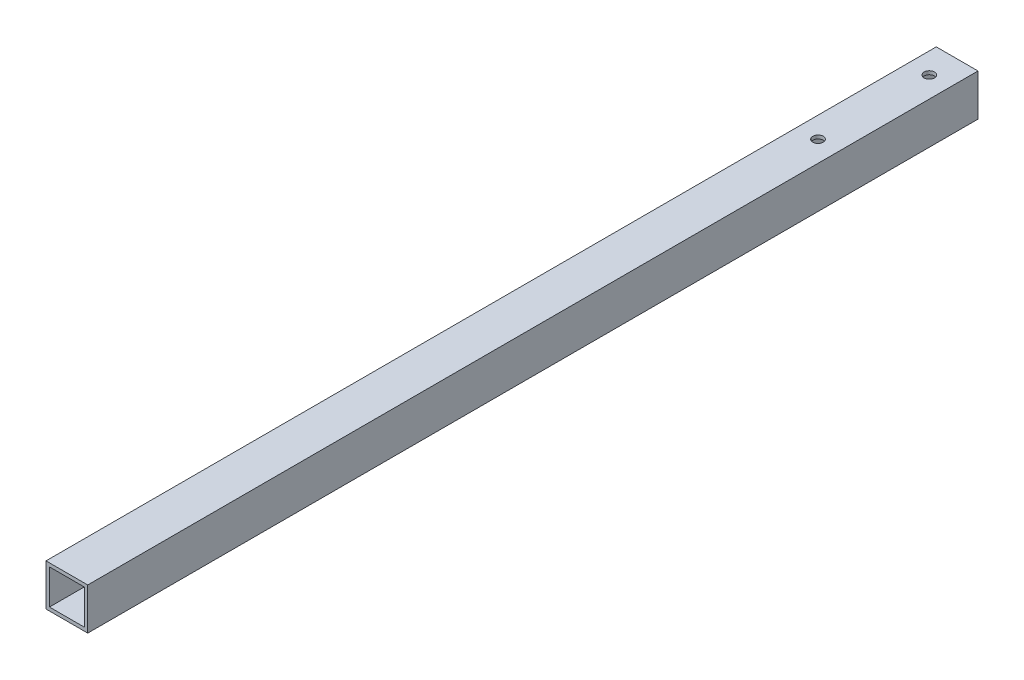
ISO-10303-21;
HEADER;
FILE_DESCRIPTION(('STEP AP214'),'2;1');
FILE_NAME('part.step','',(''),(''),'','','');
FILE_SCHEMA(('AUTOMOTIVE_DESIGN { 1 0 10303 214 1 1 1 1 }'));
ENDSEC;
DATA;
#1=APPLICATION_CONTEXT('core data for automotive mechanical design processes');
#2=APPLICATION_PROTOCOL_DEFINITION('international standard','automotive_design',2000,#1);
#3=PRODUCT_CONTEXT('',#1,'mechanical');
#4=PRODUCT('Part','Part','',(#3));
#5=PRODUCT_RELATED_PRODUCT_CATEGORY('part','',(#4));
#6=PRODUCT_DEFINITION_FORMATION('','',#4);
#7=PRODUCT_DEFINITION_CONTEXT('part definition',#1,'design');
#8=PRODUCT_DEFINITION('design','',#6,#7);
#9=PRODUCT_DEFINITION_SHAPE('','',#8);
#10=(LENGTH_UNIT() NAMED_UNIT(*) SI_UNIT(.MILLI.,.METRE.));
#11=(NAMED_UNIT(*) PLANE_ANGLE_UNIT() SI_UNIT($,.RADIAN.));
#12=(NAMED_UNIT(*) SI_UNIT($,.STERADIAN.) SOLID_ANGLE_UNIT());
#13=UNCERTAINTY_MEASURE_WITH_UNIT(LENGTH_MEASURE(1.E-05),#10,'distance_accuracy_value','');
#14=(GEOMETRIC_REPRESENTATION_CONTEXT(3) GLOBAL_UNCERTAINTY_ASSIGNED_CONTEXT((#13)) GLOBAL_UNIT_ASSIGNED_CONTEXT((#10,
#11,#12)) REPRESENTATION_CONTEXT('',''));
#15=CARTESIAN_POINT('',(0.,0.,0.));
#16=DIRECTION('',(0.,0.,1.));
#17=DIRECTION('',(1.,0.,0.));
#18=AXIS2_PLACEMENT_3D('',#15,#16,#17);
#19=CARTESIAN_POINT('',(0.,0.,406.4));
#20=DIRECTION('',(0.,0.,-1.));
#21=DIRECTION('',(-1.,0.,0.));
#22=AXIS2_PLACEMENT_3D('',#19,#20,#21);
#23=PLANE('',#22);
#24=DIRECTION('',(0.,1.,0.));
#25=VECTOR('',#24,1.);
#26=CARTESIAN_POINT('',(9.525,-9.525,406.4));
#27=LINE('',#26,#25);
#28=CARTESIAN_POINT('',(9.525,-9.525,406.4));
#29=VERTEX_POINT('',#28);
#30=CARTESIAN_POINT('',(9.525,9.525,406.4));
#31=VERTEX_POINT('',#30);
#32=EDGE_CURVE('E138',#29,#31,#27,.T.);
#33=ORIENTED_EDGE('',*,*,#32,.T.);
#34=DIRECTION('',(-1.,0.,0.));
#35=VECTOR('',#34,1.);
#36=CARTESIAN_POINT('',(-9.525,9.525,406.4));
#37=LINE('',#36,#35);
#38=CARTESIAN_POINT('',(-9.525,9.525,406.4));
#39=VERTEX_POINT('',#38);
#40=EDGE_CURVE('E141',#31,#39,#37,.T.);
#41=ORIENTED_EDGE('',*,*,#40,.T.);
#42=DIRECTION('',(0.,-1.,0.));
#43=VECTOR('',#42,1.);
#44=CARTESIAN_POINT('',(-9.525,-9.525,406.4));
#45=LINE('',#44,#43);
#46=CARTESIAN_POINT('',(-9.525,-9.525,406.4));
#47=VERTEX_POINT('',#46);
#48=EDGE_CURVE('E144',#39,#47,#45,.T.);
#49=ORIENTED_EDGE('',*,*,#48,.T.);
#50=DIRECTION('',(1.,0.,0.));
#51=VECTOR('',#50,1.);
#52=CARTESIAN_POINT('',(-9.525,-9.525,406.4));
#53=LINE('',#52,#51);
#54=EDGE_CURVE('E146',#47,#29,#53,.T.);
#55=ORIENTED_EDGE('',*,*,#54,.T.);
#56=EDGE_LOOP('',(#33,#41,#49,#55));
#57=FACE_BOUND('',#56,.T.);
#58=DIRECTION('',(0.,1.,0.));
#59=VECTOR('',#58,1.);
#60=CARTESIAN_POINT('',(7.9375,-7.9375,406.4));
#61=LINE('',#60,#59);
#62=CARTESIAN_POINT('',(7.9375,-7.9375,406.4));
#63=VERTEX_POINT('',#62);
#64=CARTESIAN_POINT('',(7.9375,7.9375,406.4));
#65=VERTEX_POINT('',#64);
#66=EDGE_CURVE('E100',#63,#65,#61,.T.);
#67=ORIENTED_EDGE('',*,*,#66,.F.);
#68=DIRECTION('',(1.,0.,0.));
#69=VECTOR('',#68,1.);
#70=CARTESIAN_POINT('',(-7.9375,-7.9375,406.4));
#71=LINE('',#70,#69);
#72=CARTESIAN_POINT('',(-7.9375,-7.9375,406.4));
#73=VERTEX_POINT('',#72);
#74=EDGE_CURVE('E122',#73,#63,#71,.T.);
#75=ORIENTED_EDGE('',*,*,#74,.F.);
#76=DIRECTION('',(0.,-1.,0.));
#77=VECTOR('',#76,1.);
#78=CARTESIAN_POINT('',(-7.9375,-7.9375,406.4));
#79=LINE('',#78,#77);
#80=CARTESIAN_POINT('',(-7.9375,7.9375,406.4));
#81=VERTEX_POINT('',#80);
#82=EDGE_CURVE('E120',#81,#73,#79,.T.);
#83=ORIENTED_EDGE('',*,*,#82,.F.);
#84=DIRECTION('',(-1.,0.,0.));
#85=VECTOR('',#84,1.);
#86=CARTESIAN_POINT('',(-7.9375,7.9375,406.4));
#87=LINE('',#86,#85);
#88=EDGE_CURVE('E108',#65,#81,#87,.T.);
#89=ORIENTED_EDGE('',*,*,#88,.F.);
#90=EDGE_LOOP('',(#67,#75,#83,#89));
#91=FACE_BOUND('',#90,.T.);
#92=ADVANCED_FACE('F33',(#57,#91),#23,.F.);
#93=CARTESIAN_POINT('',(0.,0.,0.));
#94=DIRECTION('',(0.,0.,-1.));
#95=DIRECTION('',(-1.,0.,0.));
#96=AXIS2_PLACEMENT_3D('',#93,#94,#95);
#97=PLANE('',#96);
#98=DIRECTION('',(0.,1.,0.));
#99=VECTOR('',#98,1.);
#100=CARTESIAN_POINT('',(9.525,-9.525,0.));
#101=LINE('',#100,#99);
#102=CARTESIAN_POINT('',(9.525,-9.525,0.));
#103=VERTEX_POINT('',#102);
#104=CARTESIAN_POINT('',(9.525,9.525,0.));
#105=VERTEX_POINT('',#104);
#106=EDGE_CURVE('E116',#103,#105,#101,.T.);
#107=ORIENTED_EDGE('',*,*,#106,.F.);
#108=DIRECTION('',(1.,0.,0.));
#109=VECTOR('',#108,1.);
#110=CARTESIAN_POINT('',(-9.525,-9.525,0.));
#111=LINE('',#110,#109);
#112=CARTESIAN_POINT('',(-9.525,-9.525,0.));
#113=VERTEX_POINT('',#112);
#114=EDGE_CURVE('E142',#113,#103,#111,.T.);
#115=ORIENTED_EDGE('',*,*,#114,.F.);
#116=DIRECTION('',(0.,-1.,0.));
#117=VECTOR('',#116,1.);
#118=CARTESIAN_POINT('',(-9.525,-9.525,0.));
#119=LINE('',#118,#117);
#120=CARTESIAN_POINT('',(-9.525,9.525,0.));
#121=VERTEX_POINT('',#120);
#122=EDGE_CURVE('E153',#121,#113,#119,.T.);
#123=ORIENTED_EDGE('',*,*,#122,.F.);
#124=DIRECTION('',(-1.,0.,0.));
#125=VECTOR('',#124,1.);
#126=CARTESIAN_POINT('',(-9.525,9.525,0.));
#127=LINE('',#126,#125);
#128=EDGE_CURVE('E151',#105,#121,#127,.T.);
#129=ORIENTED_EDGE('',*,*,#128,.F.);
#130=EDGE_LOOP('',(#107,#115,#123,#129));
#131=FACE_BOUND('',#130,.T.);
#132=DIRECTION('',(1.,0.,0.));
#133=VECTOR('',#132,1.);
#134=CARTESIAN_POINT('',(-7.9375,-7.9375,0.));
#135=LINE('',#134,#133);
#136=CARTESIAN_POINT('',(-7.9375,-7.9375,0.));
#137=VERTEX_POINT('',#136);
#138=CARTESIAN_POINT('',(7.9375,-7.9375,0.));
#139=VERTEX_POINT('',#138);
#140=EDGE_CURVE('E109',#137,#139,#135,.T.);
#141=ORIENTED_EDGE('',*,*,#140,.T.);
#142=DIRECTION('',(0.,1.,0.));
#143=VECTOR('',#142,1.);
#144=CARTESIAN_POINT('',(7.9375,-7.9375,0.));
#145=LINE('',#144,#143);
#146=CARTESIAN_POINT('',(7.9375,7.9375,0.));
#147=VERTEX_POINT('',#146);
#148=EDGE_CURVE('E58',#139,#147,#145,.T.);
#149=ORIENTED_EDGE('',*,*,#148,.T.);
#150=DIRECTION('',(-1.,0.,0.));
#151=VECTOR('',#150,1.);
#152=CARTESIAN_POINT('',(-7.9375,7.9375,0.));
#153=LINE('',#152,#151);
#154=CARTESIAN_POINT('',(-7.9375,7.9375,0.));
#155=VERTEX_POINT('',#154);
#156=EDGE_CURVE('E115',#147,#155,#153,.T.);
#157=ORIENTED_EDGE('',*,*,#156,.T.);
#158=DIRECTION('',(0.,-1.,0.));
#159=VECTOR('',#158,1.);
#160=CARTESIAN_POINT('',(-7.9375,-7.9375,0.));
#161=LINE('',#160,#159);
#162=EDGE_CURVE('E130',#155,#137,#161,.T.);
#163=ORIENTED_EDGE('',*,*,#162,.T.);
#164=EDGE_LOOP('',(#141,#149,#157,#163));
#165=FACE_BOUND('',#164,.T.);
#166=ADVANCED_FACE('F200',(#131,#165),#97,.T.);
#167=CARTESIAN_POINT('',(9.525,-9.525,406.4));
#168=DIRECTION('',(-1.,0.,0.));
#169=DIRECTION('',(0.,0.,1.));
#170=AXIS2_PLACEMENT_3D('',#167,#168,#169);
#171=PLANE('',#170);
#172=ORIENTED_EDGE('',*,*,#106,.T.);
#173=DIRECTION('',(0.,0.,-1.));
#174=VECTOR('',#173,1.);
#175=CARTESIAN_POINT('',(9.525,9.525,406.4));
#176=LINE('',#175,#174);
#177=EDGE_CURVE('E11',#31,#105,#176,.T.);
#178=ORIENTED_EDGE('',*,*,#177,.F.);
#179=ORIENTED_EDGE('',*,*,#32,.F.);
#180=DIRECTION('',(0.,0.,-1.));
#181=VECTOR('',#180,1.);
#182=CARTESIAN_POINT('',(9.525,-9.525,406.4));
#183=LINE('',#182,#181);
#184=EDGE_CURVE('E148',#29,#103,#183,.T.);
#185=ORIENTED_EDGE('',*,*,#184,.T.);
#186=EDGE_LOOP('',(#172,#178,#179,#185));
#187=FACE_BOUND('',#186,.T.);
#188=ADVANCED_FACE('F35',(#187),#171,.F.);
#189=CARTESIAN_POINT('',(-9.525,9.525,406.4));
#190=DIRECTION('',(0.,-1.,0.));
#191=DIRECTION('',(0.,0.,-1.));
#192=AXIS2_PLACEMENT_3D('',#189,#190,#191);
#193=PLANE('',#192);
#194=CARTESIAN_POINT('',(0.,9.525,12.7));
#195=DIRECTION('',(0.,1.,0.));
#196=DIRECTION('',(0.,0.,1.));
#197=AXIS2_PLACEMENT_3D('',#194,#195,#196);
#198=CIRCLE('',#197,2.38125);
#199=CARTESIAN_POINT('',(0.,9.525,15.08125));
#200=VERTEX_POINT('',#199);
#201=EDGE_CURVE('E171',#200,#200,#198,.T.);
#202=ORIENTED_EDGE('',*,*,#201,.F.);
#203=EDGE_LOOP('',(#202));
#204=FACE_BOUND('',#203,.T.);
#205=CARTESIAN_POINT('',(0.,9.525,63.5));
#206=DIRECTION('',(0.,1.,0.));
#207=DIRECTION('',(0.,0.,1.));
#208=AXIS2_PLACEMENT_3D('',#205,#206,#207);
#209=CIRCLE('',#208,2.38125);
#210=CARTESIAN_POINT('',(0.,9.525,65.88125));
#211=VERTEX_POINT('',#210);
#212=EDGE_CURVE('E179',#211,#211,#209,.T.);
#213=ORIENTED_EDGE('',*,*,#212,.F.);
#214=EDGE_LOOP('',(#213));
#215=FACE_BOUND('',#214,.T.);
#216=ORIENTED_EDGE('',*,*,#128,.T.);
#217=DIRECTION('',(0.,0.,-1.));
#218=VECTOR('',#217,1.);
#219=CARTESIAN_POINT('',(-9.525,9.525,406.4));
#220=LINE('',#219,#218);
#221=EDGE_CURVE('E42',#39,#121,#220,.T.);
#222=ORIENTED_EDGE('',*,*,#221,.F.);
#223=ORIENTED_EDGE('',*,*,#40,.F.);
#224=ORIENTED_EDGE('',*,*,#177,.T.);
#225=EDGE_LOOP('',(#216,#222,#223,#224));
#226=FACE_BOUND('',#225,.T.);
#227=ADVANCED_FACE('F224',(#204,#215,#226),#193,.F.);
#228=CARTESIAN_POINT('',(-9.525,-9.525,406.4));
#229=DIRECTION('',(1.,0.,0.));
#230=DIRECTION('',(0.,0.,-1.));
#231=AXIS2_PLACEMENT_3D('',#228,#229,#230);
#232=PLANE('',#231);
#233=ORIENTED_EDGE('',*,*,#122,.T.);
#234=DIRECTION('',(0.,0.,-1.));
#235=VECTOR('',#234,1.);
#236=CARTESIAN_POINT('',(-9.525,-9.525,406.4));
#237=LINE('',#236,#235);
#238=EDGE_CURVE('E158',#47,#113,#237,.T.);
#239=ORIENTED_EDGE('',*,*,#238,.F.);
#240=ORIENTED_EDGE('',*,*,#48,.F.);
#241=ORIENTED_EDGE('',*,*,#221,.T.);
#242=EDGE_LOOP('',(#233,#239,#240,#241));
#243=FACE_BOUND('',#242,.T.);
#244=ADVANCED_FACE('F222',(#243),#232,.F.);
#245=CARTESIAN_POINT('',(-9.525,-9.525,406.4));
#246=DIRECTION('',(0.,1.,0.));
#247=DIRECTION('',(0.,0.,1.));
#248=AXIS2_PLACEMENT_3D('',#245,#246,#247);
#249=PLANE('',#248);
#250=CARTESIAN_POINT('',(0.,-9.525,12.7));
#251=DIRECTION('',(0.,1.,0.));
#252=DIRECTION('',(0.,0.,1.));
#253=AXIS2_PLACEMENT_3D('',#250,#251,#252);
#254=CIRCLE('',#253,2.38125);
#255=CARTESIAN_POINT('',(0.,-9.525,15.08125));
#256=VERTEX_POINT('',#255);
#257=EDGE_CURVE('E165',#256,#256,#254,.T.);
#258=ORIENTED_EDGE('',*,*,#257,.T.);
#259=EDGE_LOOP('',(#258));
#260=FACE_BOUND('',#259,.T.);
#261=CARTESIAN_POINT('',(0.,-9.525,63.5));
#262=DIRECTION('',(0.,1.,0.));
#263=DIRECTION('',(0.,0.,1.));
#264=AXIS2_PLACEMENT_3D('',#261,#262,#263);
#265=CIRCLE('',#264,2.38125);
#266=CARTESIAN_POINT('',(0.,-9.525,65.88125));
#267=VERTEX_POINT('',#266);
#268=EDGE_CURVE('E176',#267,#267,#265,.T.);
#269=ORIENTED_EDGE('',*,*,#268,.T.);
#270=EDGE_LOOP('',(#269));
#271=FACE_BOUND('',#270,.T.);
#272=ORIENTED_EDGE('',*,*,#114,.T.);
#273=ORIENTED_EDGE('',*,*,#184,.F.);
#274=ORIENTED_EDGE('',*,*,#54,.F.);
#275=ORIENTED_EDGE('',*,*,#238,.T.);
#276=EDGE_LOOP('',(#272,#273,#274,#275));
#277=FACE_BOUND('',#276,.T.);
#278=ADVANCED_FACE('F219',(#260,#271,#277),#249,.F.);
#279=CARTESIAN_POINT('',(7.9375,-7.9375,406.4));
#280=DIRECTION('',(-1.,0.,0.));
#281=DIRECTION('',(0.,-1.,0.));
#282=AXIS2_PLACEMENT_3D('',#279,#280,#281);
#283=PLANE('',#282);
#284=ORIENTED_EDGE('',*,*,#148,.F.);
#285=DIRECTION('',(0.,0.,-1.));
#286=VECTOR('',#285,1.);
#287=CARTESIAN_POINT('',(7.9375,-7.9375,406.4));
#288=LINE('',#287,#286);
#289=EDGE_CURVE('E104',#63,#139,#288,.T.);
#290=ORIENTED_EDGE('',*,*,#289,.F.);
#291=ORIENTED_EDGE('',*,*,#66,.T.);
#292=DIRECTION('',(0.,0.,-1.));
#293=VECTOR('',#292,1.);
#294=CARTESIAN_POINT('',(7.9375,7.9375,406.4));
#295=LINE('',#294,#293);
#296=EDGE_CURVE('E103',#65,#147,#295,.T.);
#297=ORIENTED_EDGE('',*,*,#296,.T.);
#298=EDGE_LOOP('',(#284,#290,#291,#297));
#299=FACE_BOUND('',#298,.T.);
#300=ADVANCED_FACE('F102',(#299),#283,.T.);
#301=CARTESIAN_POINT('',(-7.9375,7.9375,406.4));
#302=DIRECTION('',(0.,-1.,0.));
#303=DIRECTION('',(0.,0.,-1.));
#304=AXIS2_PLACEMENT_3D('',#301,#302,#303);
#305=PLANE('',#304);
#306=CARTESIAN_POINT('',(0.,7.9375,12.7));
#307=DIRECTION('',(0.,-1.,0.));
#308=DIRECTION('',(0.,0.,-1.));
#309=AXIS2_PLACEMENT_3D('',#306,#307,#308);
#310=CIRCLE('',#309,2.38125);
#311=CARTESIAN_POINT('',(0.,7.9375,15.08125));
#312=VERTEX_POINT('',#311);
#313=EDGE_CURVE('E128',#312,#312,#310,.T.);
#314=ORIENTED_EDGE('',*,*,#313,.F.);
#315=EDGE_LOOP('',(#314));
#316=FACE_BOUND('',#315,.T.);
#317=CARTESIAN_POINT('',(0.,7.9375,63.5));
#318=DIRECTION('',(0.,-1.,0.));
#319=DIRECTION('',(0.,0.,-1.));
#320=AXIS2_PLACEMENT_3D('',#317,#318,#319);
#321=CIRCLE('',#320,2.38125);
#322=CARTESIAN_POINT('',(0.,7.9375,65.88125));
#323=VERTEX_POINT('',#322);
#324=EDGE_CURVE('E164',#323,#323,#321,.T.);
#325=ORIENTED_EDGE('',*,*,#324,.F.);
#326=EDGE_LOOP('',(#325));
#327=FACE_BOUND('',#326,.T.);
#328=ORIENTED_EDGE('',*,*,#156,.F.);
#329=ORIENTED_EDGE('',*,*,#296,.F.);
#330=ORIENTED_EDGE('',*,*,#88,.T.);
#331=DIRECTION('',(0.,0.,-1.));
#332=VECTOR('',#331,1.);
#333=CARTESIAN_POINT('',(-7.9375,7.9375,406.4));
#334=LINE('',#333,#332);
#335=EDGE_CURVE('E117',#81,#155,#334,.T.);
#336=ORIENTED_EDGE('',*,*,#335,.T.);
#337=EDGE_LOOP('',(#328,#329,#330,#336));
#338=FACE_BOUND('',#337,.T.);
#339=ADVANCED_FACE('F112',(#316,#327,#338),#305,.T.);
#340=CARTESIAN_POINT('',(-7.9375,-7.9375,406.4));
#341=DIRECTION('',(1.,0.,0.));
#342=DIRECTION('',(0.,0.,-1.));
#343=AXIS2_PLACEMENT_3D('',#340,#341,#342);
#344=PLANE('',#343);
#345=ORIENTED_EDGE('',*,*,#162,.F.);
#346=ORIENTED_EDGE('',*,*,#335,.F.);
#347=ORIENTED_EDGE('',*,*,#82,.T.);
#348=DIRECTION('',(0.,0.,-1.));
#349=VECTOR('',#348,1.);
#350=CARTESIAN_POINT('',(-7.9375,-7.9375,406.4));
#351=LINE('',#350,#349);
#352=EDGE_CURVE('E50',#73,#137,#351,.T.);
#353=ORIENTED_EDGE('',*,*,#352,.T.);
#354=EDGE_LOOP('',(#345,#346,#347,#353));
#355=FACE_BOUND('',#354,.T.);
#356=ADVANCED_FACE('F196',(#355),#344,.T.);
#357=CARTESIAN_POINT('',(-7.9375,-7.9375,406.4));
#358=DIRECTION('',(0.,1.,0.));
#359=DIRECTION('',(0.,0.,1.));
#360=AXIS2_PLACEMENT_3D('',#357,#358,#359);
#361=PLANE('',#360);
#362=CARTESIAN_POINT('',(0.,-7.9375,12.7));
#363=DIRECTION('',(0.,1.,0.));
#364=DIRECTION('',(0.,0.,1.));
#365=AXIS2_PLACEMENT_3D('',#362,#363,#364);
#366=CIRCLE('',#365,2.38125);
#367=CARTESIAN_POINT('',(0.,-7.9375,15.08125));
#368=VERTEX_POINT('',#367);
#369=EDGE_CURVE('E37',#368,#368,#366,.T.);
#370=ORIENTED_EDGE('',*,*,#369,.F.);
#371=EDGE_LOOP('',(#370));
#372=FACE_BOUND('',#371,.T.);
#373=CARTESIAN_POINT('',(0.,-7.9375,63.5));
#374=DIRECTION('',(0.,1.,0.));
#375=DIRECTION('',(0.,0.,1.));
#376=AXIS2_PLACEMENT_3D('',#373,#374,#375);
#377=CIRCLE('',#376,2.38125);
#378=CARTESIAN_POINT('',(0.,-7.9375,65.88125));
#379=VERTEX_POINT('',#378);
#380=EDGE_CURVE('E162',#379,#379,#377,.T.);
#381=ORIENTED_EDGE('',*,*,#380,.F.);
#382=EDGE_LOOP('',(#381));
#383=FACE_BOUND('',#382,.T.);
#384=ORIENTED_EDGE('',*,*,#140,.F.);
#385=ORIENTED_EDGE('',*,*,#352,.F.);
#386=ORIENTED_EDGE('',*,*,#74,.T.);
#387=ORIENTED_EDGE('',*,*,#289,.T.);
#388=EDGE_LOOP('',(#384,#385,#386,#387));
#389=FACE_BOUND('',#388,.T.);
#390=ADVANCED_FACE('F192',(#372,#383,#389),#361,.T.);
#391=CARTESIAN_POINT('',(0.,-9.525,63.5));
#392=DIRECTION('',(0.,1.,0.));
#393=DIRECTION('',(0.,0.,1.));
#394=AXIS2_PLACEMENT_3D('',#391,#392,#393);
#395=CYLINDRICAL_SURFACE('',#394,2.38125);
#396=CARTESIAN_POINT('',(0.,-7.9375,65.88125));
#397=CARTESIAN_POINT('',(0.,-7.95403645833334,65.88125));
#398=CARTESIAN_POINT('',(0.,-7.97057291666667,65.88125));
#399=CARTESIAN_POINT('',(0.,-8.00364583333334,65.88125));
#400=CARTESIAN_POINT('',(0.,-8.02018229166667,65.88125));
#401=CARTESIAN_POINT('',(0.,-8.05325520833333,65.88125));
#402=CARTESIAN_POINT('',(0.,-8.06979166666667,65.88125));
#403=CARTESIAN_POINT('',(0.,-8.10286458333334,65.88125));
#404=CARTESIAN_POINT('',(0.,-8.11940104166667,65.88125));
#405=CARTESIAN_POINT('',(0.,-8.15247395833333,65.88125));
#406=CARTESIAN_POINT('',(0.,-8.16901041666667,65.88125));
#407=CARTESIAN_POINT('',(0.,-8.20208333333334,65.88125));
#408=CARTESIAN_POINT('',(0.,-8.21861979166667,65.88125));
#409=CARTESIAN_POINT('',(0.,-8.25169270833334,65.88125));
#410=CARTESIAN_POINT('',(0.,-8.26822916666667,65.88125));
#411=CARTESIAN_POINT('',(0.,-8.30130208333333,65.88125));
#412=CARTESIAN_POINT('',(0.,-8.31783854166667,65.88125));
#413=CARTESIAN_POINT('',(0.,-8.35091145833334,65.88125));
#414=CARTESIAN_POINT('',(0.,-8.36744791666667,65.88125));
#415=CARTESIAN_POINT('',(0.,-8.40052083333334,65.88125));
#416=CARTESIAN_POINT('',(0.,-8.41705729166667,65.88125));
#417=CARTESIAN_POINT('',(0.,-8.45013020833333,65.88125));
#418=CARTESIAN_POINT('',(0.,-8.46666666666667,65.88125));
#419=CARTESIAN_POINT('',(0.,-8.49973958333334,65.88125));
#420=CARTESIAN_POINT('',(0.,-8.51627604166667,65.88125));
#421=CARTESIAN_POINT('',(0.,-8.54934895833334,65.88125));
#422=CARTESIAN_POINT('',(0.,-8.56588541666667,65.88125));
#423=CARTESIAN_POINT('',(0.,-8.59895833333334,65.88125));
#424=CARTESIAN_POINT('',(0.,-8.61549479166667,65.88125));
#425=CARTESIAN_POINT('',(0.,-8.64856770833333,65.88125));
#426=CARTESIAN_POINT('',(0.,-8.66510416666667,65.88125));
#427=CARTESIAN_POINT('',(0.,-8.69817708333333,65.88125));
#428=CARTESIAN_POINT('',(0.,-8.71471354166667,65.88125));
#429=CARTESIAN_POINT('',(0.,-8.74778645833334,65.88125));
#430=CARTESIAN_POINT('',(0.,-8.76432291666667,65.88125));
#431=CARTESIAN_POINT('',(0.,-8.79739583333334,65.88125));
#432=CARTESIAN_POINT('',(0.,-8.81393229166667,65.88125));
#433=CARTESIAN_POINT('',(0.,-8.84700520833333,65.88125));
#434=CARTESIAN_POINT('',(0.,-8.86354166666667,65.88125));
#435=CARTESIAN_POINT('',(0.,-8.89661458333333,65.88125));
#436=CARTESIAN_POINT('',(0.,-8.91315104166667,65.88125));
#437=CARTESIAN_POINT('',(0.,-8.94622395833334,65.88125));
#438=CARTESIAN_POINT('',(0.,-8.96276041666667,65.88125));
#439=CARTESIAN_POINT('',(0.,-8.99583333333334,65.88125));
#440=CARTESIAN_POINT('',(0.,-9.01236979166667,65.88125));
#441=CARTESIAN_POINT('',(0.,-9.04544270833333,65.88125));
#442=CARTESIAN_POINT('',(0.,-9.06197916666667,65.88125));
#443=CARTESIAN_POINT('',(0.,-9.09505208333334,65.88125));
#444=CARTESIAN_POINT('',(0.,-9.11158854166667,65.88125));
#445=CARTESIAN_POINT('',(0.,-9.14466145833333,65.88125));
#446=CARTESIAN_POINT('',(0.,-9.16119791666667,65.88125));
#447=CARTESIAN_POINT('',(0.,-9.19427083333334,65.88125));
#448=CARTESIAN_POINT('',(0.,-9.21080729166667,65.88125));
#449=CARTESIAN_POINT('',(0.,-9.24388020833333,65.88125));
#450=CARTESIAN_POINT('',(0.,-9.26041666666667,65.88125));
#451=CARTESIAN_POINT('',(0.,-9.29348958333333,65.88125));
#452=CARTESIAN_POINT('',(0.,-9.31002604166667,65.88125));
#453=CARTESIAN_POINT('',(0.,-9.34309895833334,65.88125));
#454=CARTESIAN_POINT('',(0.,-9.35963541666667,65.88125));
#455=CARTESIAN_POINT('',(0.,-9.39270833333333,65.88125));
#456=CARTESIAN_POINT('',(0.,-9.40924479166667,65.88125));
#457=CARTESIAN_POINT('',(0.,-9.44231770833333,65.88125));
#458=CARTESIAN_POINT('',(0.,-9.45885416666667,65.88125));
#459=CARTESIAN_POINT('',(0.,-9.49192708333333,65.88125));
#460=CARTESIAN_POINT('',(0.,-9.50846354166667,65.88125));
#461=CARTESIAN_POINT('',(0.,-9.525,65.88125));
#462=B_SPLINE_CURVE_WITH_KNOTS('',3,(#396,#397,#398,#399,#400,#401,#402,#403,#404,#405,#406,
#407,#408,#409,#410,#411,#412,#413,#414,#415,#416,#417,#418,#419,#420,#421,#422,#423,#424,#425,
#426,#427,#428,#429,#430,#431,#432,#433,#434,#435,#436,#437,#438,#439,#440,#441,#442,#443,#444,
#445,#446,#447,#448,#449,#450,#451,#452,#453,#454,#455,#456,#457,#458,#459,#460,#461),
.UNSPECIFIED.,.F.,.F.,(4,2,2,2,2,2,2,2,2,2,2,2,2,2,2,2,2,2,2,2,2,2,2,2,2,2,2,2,2,2,2,2,4),(0.,
0.0496093750000006,0.0992187500000012,0.148828125,0.198437500000001,0.248046875,0.29765625,
0.347265625000001,0.396875,0.446484375,0.496093750000001,0.545703125,0.5953125,
0.644921875000001,0.69453125,0.744140625,0.793749999999999,0.843359375,0.892968750000001,
0.942578124999999,0.9921875,1.041796875,1.09140625,1.141015625,1.190625,1.240234375,1.28984375,
1.339453125,1.3890625,1.438671875,1.48828125,1.537890625,1.5875),.UNSPECIFIED.);
#463=EDGE_CURVE('BSEAM195',#379,#267,#462,.T.);
#464=ORIENTED_EDGE('',*,*,#380,.T.);
#465=ORIENTED_EDGE('',*,*,#268,.F.);
#466=ORIENTED_EDGE('',*,*,#463,.T.);
#467=ORIENTED_EDGE('',*,*,#463,.F.);
#468=EDGE_LOOP('',(#464,#466,#465,#467));
#469=FACE_BOUND('',#468,.T.);
#470=ADVANCED_FACE('F195',(#469),#395,.F.);
#471=CARTESIAN_POINT('',(0.,-9.525,12.7));
#472=DIRECTION('',(0.,1.,0.));
#473=DIRECTION('',(0.,0.,1.));
#474=AXIS2_PLACEMENT_3D('',#471,#472,#473);
#475=CYLINDRICAL_SURFACE('',#474,2.38125);
#476=CARTESIAN_POINT('',(0.,-7.9375,15.08125));
#477=CARTESIAN_POINT('',(0.,-7.95403645833334,15.08125));
#478=CARTESIAN_POINT('',(0.,-7.97057291666667,15.08125));
#479=CARTESIAN_POINT('',(0.,-8.00364583333334,15.08125));
#480=CARTESIAN_POINT('',(0.,-8.02018229166667,15.08125));
#481=CARTESIAN_POINT('',(0.,-8.05325520833333,15.08125));
#482=CARTESIAN_POINT('',(0.,-8.06979166666667,15.08125));
#483=CARTESIAN_POINT('',(0.,-8.10286458333334,15.08125));
#484=CARTESIAN_POINT('',(0.,-8.11940104166667,15.08125));
#485=CARTESIAN_POINT('',(0.,-8.15247395833333,15.08125));
#486=CARTESIAN_POINT('',(0.,-8.16901041666667,15.08125));
#487=CARTESIAN_POINT('',(0.,-8.20208333333334,15.08125));
#488=CARTESIAN_POINT('',(0.,-8.21861979166667,15.08125));
#489=CARTESIAN_POINT('',(0.,-8.25169270833334,15.08125));
#490=CARTESIAN_POINT('',(0.,-8.26822916666667,15.08125));
#491=CARTESIAN_POINT('',(0.,-8.30130208333333,15.08125));
#492=CARTESIAN_POINT('',(0.,-8.31783854166667,15.08125));
#493=CARTESIAN_POINT('',(0.,-8.35091145833334,15.08125));
#494=CARTESIAN_POINT('',(0.,-8.36744791666667,15.08125));
#495=CARTESIAN_POINT('',(0.,-8.40052083333334,15.08125));
#496=CARTESIAN_POINT('',(0.,-8.41705729166667,15.08125));
#497=CARTESIAN_POINT('',(0.,-8.45013020833333,15.08125));
#498=CARTESIAN_POINT('',(0.,-8.46666666666667,15.08125));
#499=CARTESIAN_POINT('',(0.,-8.49973958333334,15.08125));
#500=CARTESIAN_POINT('',(0.,-8.51627604166667,15.08125));
#501=CARTESIAN_POINT('',(0.,-8.54934895833334,15.08125));
#502=CARTESIAN_POINT('',(0.,-8.56588541666667,15.08125));
#503=CARTESIAN_POINT('',(0.,-8.59895833333334,15.08125));
#504=CARTESIAN_POINT('',(0.,-8.61549479166667,15.08125));
#505=CARTESIAN_POINT('',(0.,-8.64856770833333,15.08125));
#506=CARTESIAN_POINT('',(0.,-8.66510416666667,15.08125));
#507=CARTESIAN_POINT('',(0.,-8.69817708333333,15.08125));
#508=CARTESIAN_POINT('',(0.,-8.71471354166667,15.08125));
#509=CARTESIAN_POINT('',(0.,-8.74778645833334,15.08125));
#510=CARTESIAN_POINT('',(0.,-8.76432291666667,15.08125));
#511=CARTESIAN_POINT('',(0.,-8.79739583333334,15.08125));
#512=CARTESIAN_POINT('',(0.,-8.81393229166667,15.08125));
#513=CARTESIAN_POINT('',(0.,-8.84700520833333,15.08125));
#514=CARTESIAN_POINT('',(0.,-8.86354166666667,15.08125));
#515=CARTESIAN_POINT('',(0.,-8.89661458333333,15.08125));
#516=CARTESIAN_POINT('',(0.,-8.91315104166667,15.08125));
#517=CARTESIAN_POINT('',(0.,-8.94622395833334,15.08125));
#518=CARTESIAN_POINT('',(0.,-8.96276041666667,15.08125));
#519=CARTESIAN_POINT('',(0.,-8.99583333333334,15.08125));
#520=CARTESIAN_POINT('',(0.,-9.01236979166667,15.08125));
#521=CARTESIAN_POINT('',(0.,-9.04544270833333,15.08125));
#522=CARTESIAN_POINT('',(0.,-9.06197916666667,15.08125));
#523=CARTESIAN_POINT('',(0.,-9.09505208333334,15.08125));
#524=CARTESIAN_POINT('',(0.,-9.11158854166667,15.08125));
#525=CARTESIAN_POINT('',(0.,-9.14466145833333,15.08125));
#526=CARTESIAN_POINT('',(0.,-9.16119791666667,15.08125));
#527=CARTESIAN_POINT('',(0.,-9.19427083333334,15.08125));
#528=CARTESIAN_POINT('',(0.,-9.21080729166667,15.08125));
#529=CARTESIAN_POINT('',(0.,-9.24388020833333,15.08125));
#530=CARTESIAN_POINT('',(0.,-9.26041666666667,15.08125));
#531=CARTESIAN_POINT('',(0.,-9.29348958333333,15.08125));
#532=CARTESIAN_POINT('',(0.,-9.31002604166667,15.08125));
#533=CARTESIAN_POINT('',(0.,-9.34309895833334,15.08125));
#534=CARTESIAN_POINT('',(0.,-9.35963541666667,15.08125));
#535=CARTESIAN_POINT('',(0.,-9.39270833333333,15.08125));
#536=CARTESIAN_POINT('',(0.,-9.40924479166667,15.08125));
#537=CARTESIAN_POINT('',(0.,-9.44231770833333,15.08125));
#538=CARTESIAN_POINT('',(0.,-9.45885416666667,15.08125));
#539=CARTESIAN_POINT('',(0.,-9.49192708333333,15.08125));
#540=CARTESIAN_POINT('',(0.,-9.50846354166667,15.08125));
#541=CARTESIAN_POINT('',(0.,-9.525,15.08125));
#542=B_SPLINE_CURVE_WITH_KNOTS('',3,(#476,#477,#478,#479,#480,#481,#482,#483,#484,#485,#486,
#487,#488,#489,#490,#491,#492,#493,#494,#495,#496,#497,#498,#499,#500,#501,#502,#503,#504,#505,
#506,#507,#508,#509,#510,#511,#512,#513,#514,#515,#516,#517,#518,#519,#520,#521,#522,#523,#524,
#525,#526,#527,#528,#529,#530,#531,#532,#533,#534,#535,#536,#537,#538,#539,#540,#541),
.UNSPECIFIED.,.F.,.F.,(4,2,2,2,2,2,2,2,2,2,2,2,2,2,2,2,2,2,2,2,2,2,2,2,2,2,2,2,2,2,2,2,4),(0.,
0.0496093750000006,0.0992187500000012,0.148828125,0.198437500000001,0.248046875,0.29765625,
0.347265625000001,0.396875,0.446484375,0.496093750000001,0.545703125,0.5953125,
0.644921875000001,0.69453125,0.744140625,0.793749999999999,0.843359375,0.892968750000001,
0.942578124999999,0.9921875,1.041796875,1.09140625,1.141015625,1.190625,1.240234375,1.28984375,
1.339453125,1.3890625,1.438671875,1.48828125,1.537890625,1.5875),.UNSPECIFIED.);
#543=EDGE_CURVE('BSEAM189',#368,#256,#542,.T.);
#544=ORIENTED_EDGE('',*,*,#369,.T.);
#545=ORIENTED_EDGE('',*,*,#257,.F.);
#546=ORIENTED_EDGE('',*,*,#543,.T.);
#547=ORIENTED_EDGE('',*,*,#543,.F.);
#548=EDGE_LOOP('',(#544,#546,#545,#547));
#549=FACE_BOUND('',#548,.T.);
#550=ADVANCED_FACE('F189',(#549),#475,.F.);
#551=CARTESIAN_POINT('',(0.,7.9375,65.88125));
#552=CARTESIAN_POINT('',(0.,7.95403645833333,65.88125));
#553=CARTESIAN_POINT('',(0.,7.97057291666667,65.88125));
#554=CARTESIAN_POINT('',(0.,8.00364583333334,65.88125));
#555=CARTESIAN_POINT('',(0.,8.02018229166667,65.88125));
#556=CARTESIAN_POINT('',(0.,8.05325520833333,65.88125));
#557=CARTESIAN_POINT('',(0.,8.06979166666667,65.88125));
#558=CARTESIAN_POINT('',(0.,8.10286458333333,65.88125));
#559=CARTESIAN_POINT('',(0.,8.11940104166667,65.88125));
#560=CARTESIAN_POINT('',(0.,8.15247395833333,65.88125));
#561=CARTESIAN_POINT('',(0.,8.16901041666667,65.88125));
#562=CARTESIAN_POINT('',(0.,8.20208333333334,65.88125));
#563=CARTESIAN_POINT('',(0.,8.21861979166667,65.88125));
#564=CARTESIAN_POINT('',(0.,8.25169270833333,65.88125));
#565=CARTESIAN_POINT('',(0.,8.26822916666667,65.88125));
#566=CARTESIAN_POINT('',(0.,8.30130208333333,65.88125));
#567=CARTESIAN_POINT('',(0.,8.31783854166667,65.88125));
#568=CARTESIAN_POINT('',(0.,8.35091145833333,65.88125));
#569=CARTESIAN_POINT('',(0.,8.36744791666667,65.88125));
#570=CARTESIAN_POINT('',(0.,8.40052083333333,65.88125));
#571=CARTESIAN_POINT('',(0.,8.41705729166667,65.88125));
#572=CARTESIAN_POINT('',(0.,8.45013020833333,65.88125));
#573=CARTESIAN_POINT('',(0.,8.46666666666667,65.88125));
#574=CARTESIAN_POINT('',(0.,8.49973958333333,65.88125));
#575=CARTESIAN_POINT('',(0.,8.51627604166667,65.88125));
#576=CARTESIAN_POINT('',(0.,8.54934895833333,65.88125));
#577=CARTESIAN_POINT('',(0.,8.56588541666667,65.88125));
#578=CARTESIAN_POINT('',(0.,8.59895833333333,65.88125));
#579=CARTESIAN_POINT('',(0.,8.61549479166667,65.88125));
#580=CARTESIAN_POINT('',(0.,8.64856770833333,65.88125));
#581=CARTESIAN_POINT('',(0.,8.66510416666667,65.88125));
#582=CARTESIAN_POINT('',(0.,8.69817708333333,65.88125));
#583=CARTESIAN_POINT('',(0.,8.71471354166667,65.88125));
#584=CARTESIAN_POINT('',(0.,8.74778645833333,65.88125));
#585=CARTESIAN_POINT('',(0.,8.76432291666667,65.88125));
#586=CARTESIAN_POINT('',(0.,8.79739583333333,65.88125));
#587=CARTESIAN_POINT('',(0.,8.81393229166667,65.88125));
#588=CARTESIAN_POINT('',(0.,8.84700520833333,65.88125));
#589=CARTESIAN_POINT('',(0.,8.86354166666667,65.88125));
#590=CARTESIAN_POINT('',(0.,8.89661458333333,65.88125));
#591=CARTESIAN_POINT('',(0.,8.91315104166667,65.88125));
#592=CARTESIAN_POINT('',(0.,8.94622395833333,65.88125));
#593=CARTESIAN_POINT('',(0.,8.96276041666667,65.88125));
#594=CARTESIAN_POINT('',(0.,8.99583333333334,65.88125));
#595=CARTESIAN_POINT('',(0.,9.01236979166667,65.88125));
#596=CARTESIAN_POINT('',(0.,9.04544270833333,65.88125));
#597=CARTESIAN_POINT('',(0.,9.06197916666667,65.88125));
#598=CARTESIAN_POINT('',(0.,9.09505208333333,65.88125));
#599=CARTESIAN_POINT('',(0.,9.11158854166667,65.88125));
#600=CARTESIAN_POINT('',(0.,9.14466145833333,65.88125));
#601=CARTESIAN_POINT('',(0.,9.16119791666667,65.88125));
#602=CARTESIAN_POINT('',(0.,9.19427083333333,65.88125));
#603=CARTESIAN_POINT('',(0.,9.21080729166667,65.88125));
#604=CARTESIAN_POINT('',(0.,9.24388020833333,65.88125));
#605=CARTESIAN_POINT('',(0.,9.26041666666667,65.88125));
#606=CARTESIAN_POINT('',(0.,9.29348958333333,65.88125));
#607=CARTESIAN_POINT('',(0.,9.31002604166667,65.88125));
#608=CARTESIAN_POINT('',(0.,9.34309895833333,65.88125));
#609=CARTESIAN_POINT('',(0.,9.35963541666667,65.88125));
#610=CARTESIAN_POINT('',(0.,9.39270833333333,65.88125));
#611=CARTESIAN_POINT('',(0.,9.40924479166667,65.88125));
#612=CARTESIAN_POINT('',(0.,9.44231770833333,65.88125));
#613=CARTESIAN_POINT('',(0.,9.45885416666667,65.88125));
#614=CARTESIAN_POINT('',(0.,9.49192708333333,65.88125));
#615=CARTESIAN_POINT('',(0.,9.50846354166667,65.88125));
#616=CARTESIAN_POINT('',(0.,9.525,65.88125));
#617=B_SPLINE_CURVE_WITH_KNOTS('',3,(#551,#552,#553,#554,#555,#556,#557,#558,#559,#560,#561,
#562,#563,#564,#565,#566,#567,#568,#569,#570,#571,#572,#573,#574,#575,#576,#577,#578,#579,#580,
#581,#582,#583,#584,#585,#586,#587,#588,#589,#590,#591,#592,#593,#594,#595,#596,#597,#598,#599,
#600,#601,#602,#603,#604,#605,#606,#607,#608,#609,#610,#611,#612,#613,#614,#615,#616),
.UNSPECIFIED.,.F.,.F.,(4,2,2,2,2,2,2,2,2,2,2,2,2,2,2,2,2,2,2,2,2,2,2,2,2,2,2,2,2,2,2,2,4),(0.,
0.0496093749999989,0.0992187500000012,0.148828125,0.198437499999999,0.248046875000001,
0.29765625,0.347265624999999,0.396874999999998,0.446484375,0.496093749999999,0.545703124999998,
0.5953125,0.644921874999999,0.694531249999998,0.744140625,0.793749999999999,0.843359374999998,
0.892968750000001,0.942578124999999,0.992187499999998,1.041796875,1.09140625,1.141015625,
1.190625,1.240234375,1.28984375,1.339453125,1.3890625,1.438671875,1.48828125,1.537890625,
1.5875),.UNSPECIFIED.);
#618=EDGE_CURVE('BSEAM248',#323,#211,#617,.T.);
#619=ORIENTED_EDGE('',*,*,#324,.T.);
#620=ORIENTED_EDGE('',*,*,#212,.T.);
#621=ORIENTED_EDGE('',*,*,#618,.T.);
#622=ORIENTED_EDGE('',*,*,#618,.F.);
#623=EDGE_LOOP('',(#619,#621,#620,#622));
#624=FACE_BOUND('',#623,.T.);
#625=ADVANCED_FACE('F248',(#624),#395,.F.);
#626=CARTESIAN_POINT('',(0.,7.9375,15.08125));
#627=CARTESIAN_POINT('',(0.,7.95403645833333,15.08125));
#628=CARTESIAN_POINT('',(0.,7.97057291666667,15.08125));
#629=CARTESIAN_POINT('',(0.,8.00364583333334,15.08125));
#630=CARTESIAN_POINT('',(0.,8.02018229166667,15.08125));
#631=CARTESIAN_POINT('',(0.,8.05325520833333,15.08125));
#632=CARTESIAN_POINT('',(0.,8.06979166666667,15.08125));
#633=CARTESIAN_POINT('',(0.,8.10286458333333,15.08125));
#634=CARTESIAN_POINT('',(0.,8.11940104166667,15.08125));
#635=CARTESIAN_POINT('',(0.,8.15247395833333,15.08125));
#636=CARTESIAN_POINT('',(0.,8.16901041666667,15.08125));
#637=CARTESIAN_POINT('',(0.,8.20208333333334,15.08125));
#638=CARTESIAN_POINT('',(0.,8.21861979166667,15.08125));
#639=CARTESIAN_POINT('',(0.,8.25169270833333,15.08125));
#640=CARTESIAN_POINT('',(0.,8.26822916666667,15.08125));
#641=CARTESIAN_POINT('',(0.,8.30130208333333,15.08125));
#642=CARTESIAN_POINT('',(0.,8.31783854166667,15.08125));
#643=CARTESIAN_POINT('',(0.,8.35091145833333,15.08125));
#644=CARTESIAN_POINT('',(0.,8.36744791666667,15.08125));
#645=CARTESIAN_POINT('',(0.,8.40052083333333,15.08125));
#646=CARTESIAN_POINT('',(0.,8.41705729166667,15.08125));
#647=CARTESIAN_POINT('',(0.,8.45013020833333,15.08125));
#648=CARTESIAN_POINT('',(0.,8.46666666666667,15.08125));
#649=CARTESIAN_POINT('',(0.,8.49973958333333,15.08125));
#650=CARTESIAN_POINT('',(0.,8.51627604166667,15.08125));
#651=CARTESIAN_POINT('',(0.,8.54934895833333,15.08125));
#652=CARTESIAN_POINT('',(0.,8.56588541666667,15.08125));
#653=CARTESIAN_POINT('',(0.,8.59895833333333,15.08125));
#654=CARTESIAN_POINT('',(0.,8.61549479166667,15.08125));
#655=CARTESIAN_POINT('',(0.,8.64856770833333,15.08125));
#656=CARTESIAN_POINT('',(0.,8.66510416666667,15.08125));
#657=CARTESIAN_POINT('',(0.,8.69817708333333,15.08125));
#658=CARTESIAN_POINT('',(0.,8.71471354166667,15.08125));
#659=CARTESIAN_POINT('',(0.,8.74778645833333,15.08125));
#660=CARTESIAN_POINT('',(0.,8.76432291666667,15.08125));
#661=CARTESIAN_POINT('',(0.,8.79739583333333,15.08125));
#662=CARTESIAN_POINT('',(0.,8.81393229166667,15.08125));
#663=CARTESIAN_POINT('',(0.,8.84700520833333,15.08125));
#664=CARTESIAN_POINT('',(0.,8.86354166666667,15.08125));
#665=CARTESIAN_POINT('',(0.,8.89661458333333,15.08125));
#666=CARTESIAN_POINT('',(0.,8.91315104166667,15.08125));
#667=CARTESIAN_POINT('',(0.,8.94622395833333,15.08125));
#668=CARTESIAN_POINT('',(0.,8.96276041666667,15.08125));
#669=CARTESIAN_POINT('',(0.,8.99583333333334,15.08125));
#670=CARTESIAN_POINT('',(0.,9.01236979166667,15.08125));
#671=CARTESIAN_POINT('',(0.,9.04544270833333,15.08125));
#672=CARTESIAN_POINT('',(0.,9.06197916666667,15.08125));
#673=CARTESIAN_POINT('',(0.,9.09505208333333,15.08125));
#674=CARTESIAN_POINT('',(0.,9.11158854166667,15.08125));
#675=CARTESIAN_POINT('',(0.,9.14466145833333,15.08125));
#676=CARTESIAN_POINT('',(0.,9.16119791666667,15.08125));
#677=CARTESIAN_POINT('',(0.,9.19427083333333,15.08125));
#678=CARTESIAN_POINT('',(0.,9.21080729166667,15.08125));
#679=CARTESIAN_POINT('',(0.,9.24388020833333,15.08125));
#680=CARTESIAN_POINT('',(0.,9.26041666666667,15.08125));
#681=CARTESIAN_POINT('',(0.,9.29348958333333,15.08125));
#682=CARTESIAN_POINT('',(0.,9.31002604166667,15.08125));
#683=CARTESIAN_POINT('',(0.,9.34309895833333,15.08125));
#684=CARTESIAN_POINT('',(0.,9.35963541666667,15.08125));
#685=CARTESIAN_POINT('',(0.,9.39270833333333,15.08125));
#686=CARTESIAN_POINT('',(0.,9.40924479166667,15.08125));
#687=CARTESIAN_POINT('',(0.,9.44231770833333,15.08125));
#688=CARTESIAN_POINT('',(0.,9.45885416666667,15.08125));
#689=CARTESIAN_POINT('',(0.,9.49192708333333,15.08125));
#690=CARTESIAN_POINT('',(0.,9.50846354166667,15.08125));
#691=CARTESIAN_POINT('',(0.,9.525,15.08125));
#692=B_SPLINE_CURVE_WITH_KNOTS('',3,(#626,#627,#628,#629,#630,#631,#632,#633,#634,#635,#636,
#637,#638,#639,#640,#641,#642,#643,#644,#645,#646,#647,#648,#649,#650,#651,#652,#653,#654,#655,
#656,#657,#658,#659,#660,#661,#662,#663,#664,#665,#666,#667,#668,#669,#670,#671,#672,#673,#674,
#675,#676,#677,#678,#679,#680,#681,#682,#683,#684,#685,#686,#687,#688,#689,#690,#691),
.UNSPECIFIED.,.F.,.F.,(4,2,2,2,2,2,2,2,2,2,2,2,2,2,2,2,2,2,2,2,2,2,2,2,2,2,2,2,2,2,2,2,4),(0.,
0.0496093749999989,0.0992187500000012,0.148828125,0.198437499999999,0.248046875000001,
0.29765625,0.347265624999999,0.396874999999998,0.446484375,0.496093749999999,0.545703124999998,
0.5953125,0.644921874999999,0.694531249999998,0.744140625,0.793749999999999,0.843359374999998,
0.892968750000001,0.942578124999999,0.992187499999998,1.041796875,1.09140625,1.141015625,
1.190625,1.240234375,1.28984375,1.339453125,1.3890625,1.438671875,1.48828125,1.537890625,
1.5875),.UNSPECIFIED.);
#693=EDGE_CURVE('BSEAM250',#312,#200,#692,.T.);
#694=ORIENTED_EDGE('',*,*,#313,.T.);
#695=ORIENTED_EDGE('',*,*,#201,.T.);
#696=ORIENTED_EDGE('',*,*,#693,.T.);
#697=ORIENTED_EDGE('',*,*,#693,.F.);
#698=EDGE_LOOP('',(#694,#696,#695,#697));
#699=FACE_BOUND('',#698,.T.);
#700=ADVANCED_FACE('F250',(#699),#475,.F.);
#701=CLOSED_SHELL('',(#92,#166,#188,#227,#244,#278,#300,#339,#356,#390,#470,#550,#625,#700));
#702=MANIFOLD_SOLID_BREP('B2',#701);
#703=ADVANCED_BREP_SHAPE_REPRESENTATION('',(#18,#702),#14);
#704=SHAPE_DEFINITION_REPRESENTATION(#9,#703);
ENDSEC;
END-ISO-10303-21;
